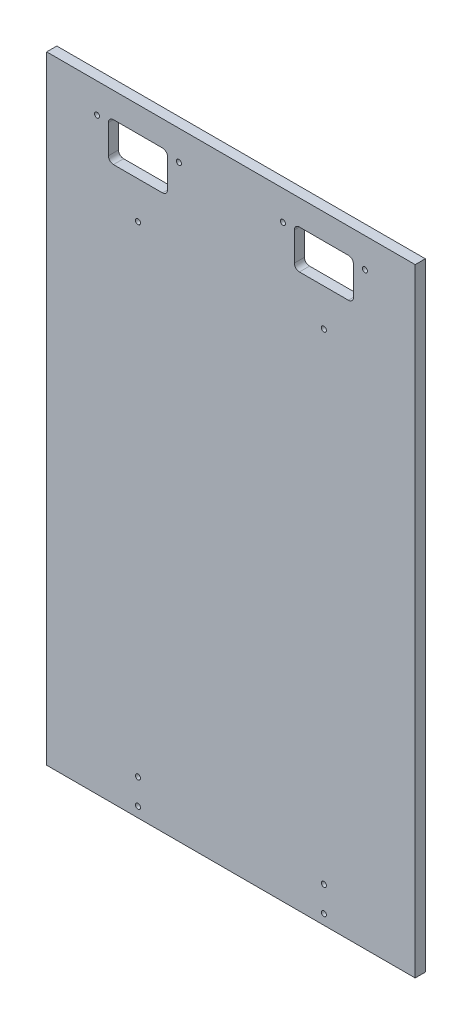
ISO-10303-21;
HEADER;
FILE_DESCRIPTION(('STEP AP214'),'2;1');
FILE_NAME('part.step','',(''),(''),'','','');
FILE_SCHEMA(('AUTOMOTIVE_DESIGN { 1 0 10303 214 1 1 1 1 }'));
ENDSEC;
DATA;
#1=APPLICATION_CONTEXT('core data for automotive mechanical design processes');
#2=APPLICATION_PROTOCOL_DEFINITION('international standard','automotive_design',2000,#1);
#3=PRODUCT_CONTEXT('',#1,'mechanical');
#4=PRODUCT('Part','Part','',(#3));
#5=PRODUCT_RELATED_PRODUCT_CATEGORY('part','',(#4));
#6=PRODUCT_DEFINITION_FORMATION('','',#4);
#7=PRODUCT_DEFINITION_CONTEXT('part definition',#1,'design');
#8=PRODUCT_DEFINITION('design','',#6,#7);
#9=PRODUCT_DEFINITION_SHAPE('','',#8);
#10=(LENGTH_UNIT() NAMED_UNIT(*) SI_UNIT(.MILLI.,.METRE.));
#11=(NAMED_UNIT(*) PLANE_ANGLE_UNIT() SI_UNIT($,.RADIAN.));
#12=(NAMED_UNIT(*) SI_UNIT($,.STERADIAN.) SOLID_ANGLE_UNIT());
#13=UNCERTAINTY_MEASURE_WITH_UNIT(LENGTH_MEASURE(1.E-05),#10,'distance_accuracy_value','');
#14=(GEOMETRIC_REPRESENTATION_CONTEXT(3) GLOBAL_UNCERTAINTY_ASSIGNED_CONTEXT((#13)) GLOBAL_UNIT_ASSIGNED_CONTEXT((#10,
#11,#12)) REPRESENTATION_CONTEXT('',''));
#15=CARTESIAN_POINT('',(0.,0.,0.));
#16=DIRECTION('',(0.,0.,1.));
#17=DIRECTION('',(1.,0.,0.));
#18=AXIS2_PLACEMENT_3D('',#15,#16,#17);
#19=CARTESIAN_POINT('',(0.,0.,6.));
#20=DIRECTION('',(0.,0.,1.));
#21=DIRECTION('',(1.,0.,0.));
#22=AXIS2_PLACEMENT_3D('',#19,#20,#21);
#23=PLANE('',#22);
#24=CARTESIAN_POINT('',(55.,266.,6.));
#25=DIRECTION('',(0.,0.,1.));
#26=DIRECTION('',(-1.,0.,0.));
#27=AXIS2_PLACEMENT_3D('',#24,#25,#26);
#28=CIRCLE('',#27,1.5);
#29=CARTESIAN_POINT('',(53.5,266.,6.));
#30=VERTEX_POINT('',#29);
#31=EDGE_CURVE('E811',#30,#30,#28,.T.);
#32=ORIENTED_EDGE('',*,*,#31,.F.);
#33=EDGE_LOOP('',(#32));
#34=FACE_BOUND('',#33,.T.);
#35=CARTESIAN_POINT('',(-30.75,308.5,6.));
#36=DIRECTION('',(0.,0.,1.));
#37=DIRECTION('',(-1.,0.,0.));
#38=AXIS2_PLACEMENT_3D('',#35,#36,#37);
#39=CIRCLE('',#38,1.5);
#40=CARTESIAN_POINT('',(-32.25,308.5,6.));
#41=VERTEX_POINT('',#40);
#42=EDGE_CURVE('E796',#41,#41,#39,.T.);
#43=ORIENTED_EDGE('',*,*,#42,.F.);
#44=EDGE_LOOP('',(#43));
#45=FACE_BOUND('',#44,.T.);
#46=CARTESIAN_POINT('',(-79.25,308.5,6.));
#47=DIRECTION('',(0.,0.,1.));
#48=DIRECTION('',(1.,0.,0.));
#49=AXIS2_PLACEMENT_3D('',#46,#47,#48);
#50=CIRCLE('',#49,1.5);
#51=CARTESIAN_POINT('',(-77.75,308.5,6.));
#52=VERTEX_POINT('',#51);
#53=EDGE_CURVE('E337',#52,#52,#50,.T.);
#54=ORIENTED_EDGE('',*,*,#53,.F.);
#55=EDGE_LOOP('',(#54));
#56=FACE_BOUND('',#55,.T.);
#57=CARTESIAN_POINT('',(55.,-18.4999999999999,6.));
#58=DIRECTION('',(0.,0.,1.));
#59=DIRECTION('',(-1.,0.,0.));
#60=AXIS2_PLACEMENT_3D('',#57,#58,#59);
#61=CIRCLE('',#60,1.5);
#62=CARTESIAN_POINT('',(53.5,-18.4999999999999,6.));
#63=VERTEX_POINT('',#62);
#64=EDGE_CURVE('E364',#63,#63,#61,.T.);
#65=ORIENTED_EDGE('',*,*,#64,.F.);
#66=EDGE_LOOP('',(#65));
#67=FACE_BOUND('',#66,.T.);
#68=CARTESIAN_POINT('',(-55.,-33.4999999999999,6.));
#69=DIRECTION('',(0.,0.,1.));
#70=DIRECTION('',(1.,0.,0.));
#71=AXIS2_PLACEMENT_3D('',#68,#69,#70);
#72=CIRCLE('',#71,1.5);
#73=CARTESIAN_POINT('',(-53.5,-33.4999999999999,6.));
#74=VERTEX_POINT('',#73);
#75=EDGE_CURVE('E365',#74,#74,#72,.T.);
#76=ORIENTED_EDGE('',*,*,#75,.F.);
#77=EDGE_LOOP('',(#76));
#78=FACE_BOUND('',#77,.T.);
#79=DIRECTION('',(-3.71173897856871E-07,-0.999999999999931,0.));
#80=VECTOR('',#79,1.);
#81=CARTESIAN_POINT('',(-108.999999999998,326.,6.));
#82=LINE('',#81,#80);
#83=CARTESIAN_POINT('',(-108.999999999998,326.,6.));
#84=VERTEX_POINT('',#83);
#85=CARTESIAN_POINT('',(-109.000135664058,-39.4999999999999,6.));
#86=VERTEX_POINT('',#85);
#87=EDGE_CURVE('E193',#84,#86,#82,.T.);
#88=ORIENTED_EDGE('',*,*,#87,.T.);
#89=DIRECTION('',(1.,0.,0.));
#90=VECTOR('',#89,1.);
#91=CARTESIAN_POINT('',(-109.000135664058,-39.4999999999999,6.));
#92=LINE('',#91,#90);
#93=CARTESIAN_POINT('',(109.000000000002,-39.4999999999999,6.));
#94=VERTEX_POINT('',#93);
#95=EDGE_CURVE('E181',#86,#94,#92,.T.);
#96=ORIENTED_EDGE('',*,*,#95,.T.);
#97=DIRECTION('',(0.,1.,0.));
#98=VECTOR('',#97,1.);
#99=CARTESIAN_POINT('',(109.000000000002,-39.4999999999999,6.));
#100=LINE('',#99,#98);
#101=CARTESIAN_POINT('',(109.000000000002,326.,6.));
#102=VERTEX_POINT('',#101);
#103=EDGE_CURVE('E192',#94,#102,#100,.T.);
#104=ORIENTED_EDGE('',*,*,#103,.T.);
#105=DIRECTION('',(-1.,0.,0.));
#106=VECTOR('',#105,1.);
#107=CARTESIAN_POINT('',(-108.999999999998,326.,6.));
#108=LINE('',#107,#106);
#109=EDGE_CURVE('E198',#102,#84,#108,.T.);
#110=ORIENTED_EDGE('',*,*,#109,.T.);
#111=EDGE_LOOP('',(#88,#96,#104,#110));
#112=FACE_BOUND('',#111,.T.);
#113=CARTESIAN_POINT('',(-55.,-18.4999999999999,6.));
#114=DIRECTION('',(0.,0.,1.));
#115=DIRECTION('',(1.,0.,0.));
#116=AXIS2_PLACEMENT_3D('',#113,#114,#115);
#117=CIRCLE('',#116,1.5);
#118=CARTESIAN_POINT('',(-53.5,-18.4999999999999,6.));
#119=VERTEX_POINT('',#118);
#120=EDGE_CURVE('E353',#119,#119,#117,.T.);
#121=ORIENTED_EDGE('',*,*,#120,.F.);
#122=EDGE_LOOP('',(#121));
#123=FACE_BOUND('',#122,.T.);
#124=CARTESIAN_POINT('',(55.,-33.4999999999999,6.));
#125=DIRECTION('',(0.,0.,1.));
#126=DIRECTION('',(-1.,0.,0.));
#127=AXIS2_PLACEMENT_3D('',#124,#125,#126);
#128=CIRCLE('',#127,1.5);
#129=CARTESIAN_POINT('',(53.5,-33.4999999999999,6.));
#130=VERTEX_POINT('',#129);
#131=EDGE_CURVE('E341',#130,#130,#128,.T.);
#132=ORIENTED_EDGE('',*,*,#131,.F.);
#133=EDGE_LOOP('',(#132));
#134=FACE_BOUND('',#133,.T.);
#135=DIRECTION('',(1.,0.,0.));
#136=VECTOR('',#135,1.);
#137=CARTESIAN_POINT('',(-37.4999999999983,288.,6.));
#138=LINE('',#137,#136);
#139=CARTESIAN_POINT('',(-69.4999999999983,288.,6.));
#140=VERTEX_POINT('',#139);
#141=CARTESIAN_POINT('',(-40.4999999999983,288.,6.));
#142=VERTEX_POINT('',#141);
#143=EDGE_CURVE('E306',#140,#142,#138,.T.);
#144=ORIENTED_EDGE('',*,*,#143,.F.);
#145=CARTESIAN_POINT('',(-69.4999999999983,291.,6.));
#146=DIRECTION('',(0.,0.,1.));
#147=DIRECTION('',(1.,0.,0.));
#148=AXIS2_PLACEMENT_3D('',#145,#146,#147);
#149=CIRCLE('',#148,3.);
#150=CARTESIAN_POINT('',(-72.4999999999983,291.,6.));
#151=VERTEX_POINT('',#150);
#152=EDGE_CURVE('E12',#140,#151,#149,.F.);
#153=ORIENTED_EDGE('',*,*,#152,.T.);
#154=DIRECTION('',(0.,-1.,0.));
#155=VECTOR('',#154,1.);
#156=CARTESIAN_POINT('',(-72.4999999999983,288.,6.));
#157=LINE('',#156,#155);
#158=CARTESIAN_POINT('',(-72.4999999999983,308.,6.));
#159=VERTEX_POINT('',#158);
#160=EDGE_CURVE('E304',#159,#151,#157,.T.);
#161=ORIENTED_EDGE('',*,*,#160,.F.);
#162=CARTESIAN_POINT('',(-69.4999999999983,308.,6.));
#163=DIRECTION('',(0.,0.,1.));
#164=DIRECTION('',(1.,0.,0.));
#165=AXIS2_PLACEMENT_3D('',#162,#163,#164);
#166=CIRCLE('',#165,3.);
#167=CARTESIAN_POINT('',(-69.4999999999983,311.,6.));
#168=VERTEX_POINT('',#167);
#169=EDGE_CURVE('E274',#159,#168,#166,.F.);
#170=ORIENTED_EDGE('',*,*,#169,.T.);
#171=DIRECTION('',(-1.,0.,0.));
#172=VECTOR('',#171,1.);
#173=CARTESIAN_POINT('',(-37.4999999999983,311.,6.));
#174=LINE('',#173,#172);
#175=CARTESIAN_POINT('',(-40.4999999999983,311.,6.));
#176=VERTEX_POINT('',#175);
#177=EDGE_CURVE('E330',#176,#168,#174,.T.);
#178=ORIENTED_EDGE('',*,*,#177,.F.);
#179=CARTESIAN_POINT('',(-40.4999999999983,308.,6.));
#180=DIRECTION('',(0.,0.,1.));
#181=DIRECTION('',(1.,0.,0.));
#182=AXIS2_PLACEMENT_3D('',#179,#180,#181);
#183=CIRCLE('',#182,3.);
#184=CARTESIAN_POINT('',(-37.4999999999983,308.,6.));
#185=VERTEX_POINT('',#184);
#186=EDGE_CURVE('E279',#176,#185,#183,.F.);
#187=ORIENTED_EDGE('',*,*,#186,.T.);
#188=DIRECTION('',(0.,1.,0.));
#189=VECTOR('',#188,1.);
#190=CARTESIAN_POINT('',(-37.4999999999983,288.,6.));
#191=LINE('',#190,#189);
#192=CARTESIAN_POINT('',(-37.4999999999983,291.,6.));
#193=VERTEX_POINT('',#192);
#194=EDGE_CURVE('E314',#193,#185,#191,.T.);
#195=ORIENTED_EDGE('',*,*,#194,.F.);
#196=CARTESIAN_POINT('',(-40.4999999999983,291.,6.));
#197=DIRECTION('',(0.,0.,1.));
#198=DIRECTION('',(1.,0.,0.));
#199=AXIS2_PLACEMENT_3D('',#196,#197,#198);
#200=CIRCLE('',#199,3.);
#201=EDGE_CURVE('E58',#193,#142,#200,.F.);
#202=ORIENTED_EDGE('',*,*,#201,.T.);
#203=EDGE_LOOP('',(#144,#153,#161,#170,#178,#187,#195,#202));
#204=FACE_BOUND('',#203,.T.);
#205=CARTESIAN_POINT('',(-55.,266.,6.));
#206=DIRECTION('',(0.,0.,1.));
#207=DIRECTION('',(1.,0.,0.));
#208=AXIS2_PLACEMENT_3D('',#205,#206,#207);
#209=CIRCLE('',#208,1.5);
#210=CARTESIAN_POINT('',(-53.5,266.,6.));
#211=VERTEX_POINT('',#210);
#212=EDGE_CURVE('E571',#211,#211,#209,.T.);
#213=ORIENTED_EDGE('',*,*,#212,.F.);
#214=EDGE_LOOP('',(#213));
#215=FACE_BOUND('',#214,.T.);
#216=CARTESIAN_POINT('',(30.75,308.5,6.));
#217=DIRECTION('',(0.,0.,1.));
#218=DIRECTION('',(1.,0.,0.));
#219=AXIS2_PLACEMENT_3D('',#216,#217,#218);
#220=CIRCLE('',#219,1.5);
#221=CARTESIAN_POINT('',(32.25,308.5,6.));
#222=VERTEX_POINT('',#221);
#223=EDGE_CURVE('E566',#222,#222,#220,.T.);
#224=ORIENTED_EDGE('',*,*,#223,.F.);
#225=EDGE_LOOP('',(#224));
#226=FACE_BOUND('',#225,.T.);
#227=CARTESIAN_POINT('',(79.25,308.5,6.));
#228=DIRECTION('',(0.,0.,1.));
#229=DIRECTION('',(-1.,0.,0.));
#230=AXIS2_PLACEMENT_3D('',#227,#228,#229);
#231=CIRCLE('',#230,1.5);
#232=CARTESIAN_POINT('',(77.75,308.5,6.));
#233=VERTEX_POINT('',#232);
#234=EDGE_CURVE('E527',#233,#233,#231,.T.);
#235=ORIENTED_EDGE('',*,*,#234,.F.);
#236=EDGE_LOOP('',(#235));
#237=FACE_BOUND('',#236,.T.);
#238=DIRECTION('',(0.,1.,0.));
#239=VECTOR('',#238,1.);
#240=CARTESIAN_POINT('',(72.4999999999983,288.,6.));
#241=LINE('',#240,#239);
#242=CARTESIAN_POINT('',(72.4999999999983,291.,6.));
#243=VERTEX_POINT('',#242);
#244=CARTESIAN_POINT('',(72.4999999999983,308.,6.));
#245=VERTEX_POINT('',#244);
#246=EDGE_CURVE('E541',#243,#245,#241,.T.);
#247=ORIENTED_EDGE('',*,*,#246,.F.);
#248=CARTESIAN_POINT('',(69.4999999999983,291.,6.));
#249=DIRECTION('',(0.,0.,1.));
#250=DIRECTION('',(1.,0.,0.));
#251=AXIS2_PLACEMENT_3D('',#248,#249,#250);
#252=CIRCLE('',#251,3.);
#253=CARTESIAN_POINT('',(69.4999999999983,288.,6.));
#254=VERTEX_POINT('',#253);
#255=EDGE_CURVE('E259',#243,#254,#252,.F.);
#256=ORIENTED_EDGE('',*,*,#255,.T.);
#257=DIRECTION('',(1.,0.,0.));
#258=VECTOR('',#257,1.);
#259=CARTESIAN_POINT('',(37.4999999999983,288.,6.));
#260=LINE('',#259,#258);
#261=CARTESIAN_POINT('',(40.4999999999983,288.,6.));
#262=VERTEX_POINT('',#261);
#263=EDGE_CURVE('E526',#262,#254,#260,.T.);
#264=ORIENTED_EDGE('',*,*,#263,.F.);
#265=CARTESIAN_POINT('',(40.4999999999983,291.,6.));
#266=DIRECTION('',(0.,0.,1.));
#267=DIRECTION('',(1.,0.,0.));
#268=AXIS2_PLACEMENT_3D('',#265,#266,#267);
#269=CIRCLE('',#268,3.);
#270=CARTESIAN_POINT('',(37.4999999999983,291.,6.));
#271=VERTEX_POINT('',#270);
#272=EDGE_CURVE('E254',#262,#271,#269,.F.);
#273=ORIENTED_EDGE('',*,*,#272,.T.);
#274=DIRECTION('',(0.,-1.,0.));
#275=VECTOR('',#274,1.);
#276=CARTESIAN_POINT('',(37.4999999999983,288.,6.));
#277=LINE('',#276,#275);
#278=CARTESIAN_POINT('',(37.4999999999983,308.,6.));
#279=VERTEX_POINT('',#278);
#280=EDGE_CURVE('E495',#279,#271,#277,.T.);
#281=ORIENTED_EDGE('',*,*,#280,.F.);
#282=CARTESIAN_POINT('',(40.4999999999983,308.,6.));
#283=DIRECTION('',(0.,0.,1.));
#284=DIRECTION('',(1.,0.,0.));
#285=AXIS2_PLACEMENT_3D('',#282,#283,#284);
#286=CIRCLE('',#285,3.);
#287=CARTESIAN_POINT('',(40.4999999999983,311.,6.));
#288=VERTEX_POINT('',#287);
#289=EDGE_CURVE('E269',#279,#288,#286,.F.);
#290=ORIENTED_EDGE('',*,*,#289,.T.);
#291=DIRECTION('',(-1.,0.,0.));
#292=VECTOR('',#291,1.);
#293=CARTESIAN_POINT('',(37.4999999999983,311.,6.));
#294=LINE('',#293,#292);
#295=CARTESIAN_POINT('',(69.4999999999983,311.,6.));
#296=VERTEX_POINT('',#295);
#297=EDGE_CURVE('E504',#296,#288,#294,.T.);
#298=ORIENTED_EDGE('',*,*,#297,.F.);
#299=CARTESIAN_POINT('',(69.4999999999983,308.,6.));
#300=DIRECTION('',(0.,0.,1.));
#301=DIRECTION('',(1.,0.,0.));
#302=AXIS2_PLACEMENT_3D('',#299,#300,#301);
#303=CIRCLE('',#302,3.);
#304=EDGE_CURVE('E264',#296,#245,#303,.F.);
#305=ORIENTED_EDGE('',*,*,#304,.T.);
#306=EDGE_LOOP('',(#247,#256,#264,#273,#281,#290,#298,#305));
#307=FACE_BOUND('',#306,.T.);
#308=ADVANCED_FACE('F42',(#34,#45,#56,#67,#78,#112,#123,#134,#204,#215,#226,#237,#307),#23,.T.);
#309=CARTESIAN_POINT('',(0.,0.,0.));
#310=DIRECTION('',(0.,0.,1.));
#311=DIRECTION('',(1.,0.,0.));
#312=AXIS2_PLACEMENT_3D('',#309,#310,#311);
#313=PLANE('',#312);
#314=CARTESIAN_POINT('',(79.25,308.5,0.));
#315=DIRECTION('',(0.,0.,1.));
#316=DIRECTION('',(-1.,0.,0.));
#317=AXIS2_PLACEMENT_3D('',#314,#315,#316);
#318=CIRCLE('',#317,1.5);
#319=CARTESIAN_POINT('',(77.75,308.5,0.));
#320=VERTEX_POINT('',#319);
#321=EDGE_CURVE('E503',#320,#320,#318,.T.);
#322=ORIENTED_EDGE('',*,*,#321,.T.);
#323=EDGE_LOOP('',(#322));
#324=FACE_BOUND('',#323,.T.);
#325=CARTESIAN_POINT('',(55.,266.,0.));
#326=DIRECTION('',(0.,0.,1.));
#327=DIRECTION('',(-1.,0.,0.));
#328=AXIS2_PLACEMENT_3D('',#325,#326,#327);
#329=CIRCLE('',#328,1.5);
#330=CARTESIAN_POINT('',(53.5,266.,0.));
#331=VERTEX_POINT('',#330);
#332=EDGE_CURVE('E532',#331,#331,#329,.T.);
#333=ORIENTED_EDGE('',*,*,#332,.T.);
#334=EDGE_LOOP('',(#333));
#335=FACE_BOUND('',#334,.T.);
#336=CARTESIAN_POINT('',(30.75,308.5,0.));
#337=DIRECTION('',(0.,0.,1.));
#338=DIRECTION('',(1.,0.,0.));
#339=AXIS2_PLACEMENT_3D('',#336,#337,#338);
#340=CIRCLE('',#339,1.5);
#341=CARTESIAN_POINT('',(32.25,308.5,0.));
#342=VERTEX_POINT('',#341);
#343=EDGE_CURVE('E570',#342,#342,#340,.T.);
#344=ORIENTED_EDGE('',*,*,#343,.T.);
#345=EDGE_LOOP('',(#344));
#346=FACE_BOUND('',#345,.T.);
#347=CARTESIAN_POINT('',(-30.75,308.5,0.));
#348=DIRECTION('',(0.,0.,1.));
#349=DIRECTION('',(-1.,0.,0.));
#350=AXIS2_PLACEMENT_3D('',#347,#348,#349);
#351=CIRCLE('',#350,1.5);
#352=CARTESIAN_POINT('',(-32.25,308.5,0.));
#353=VERTEX_POINT('',#352);
#354=EDGE_CURVE('E569',#353,#353,#351,.T.);
#355=ORIENTED_EDGE('',*,*,#354,.T.);
#356=EDGE_LOOP('',(#355));
#357=FACE_BOUND('',#356,.T.);
#358=CARTESIAN_POINT('',(-55.,266.,0.));
#359=DIRECTION('',(0.,0.,1.));
#360=DIRECTION('',(1.,0.,0.));
#361=AXIS2_PLACEMENT_3D('',#358,#359,#360);
#362=CIRCLE('',#361,1.5);
#363=CARTESIAN_POINT('',(-53.5,266.,0.));
#364=VERTEX_POINT('',#363);
#365=EDGE_CURVE('E573',#364,#364,#362,.T.);
#366=ORIENTED_EDGE('',*,*,#365,.T.);
#367=EDGE_LOOP('',(#366));
#368=FACE_BOUND('',#367,.T.);
#369=CARTESIAN_POINT('',(-79.25,308.5,0.));
#370=DIRECTION('',(0.,0.,1.));
#371=DIRECTION('',(1.,0.,0.));
#372=AXIS2_PLACEMENT_3D('',#369,#370,#371);
#373=CIRCLE('',#372,1.5);
#374=CARTESIAN_POINT('',(-77.75,308.5,0.));
#375=VERTEX_POINT('',#374);
#376=EDGE_CURVE('E319',#375,#375,#373,.T.);
#377=ORIENTED_EDGE('',*,*,#376,.T.);
#378=EDGE_LOOP('',(#377));
#379=FACE_BOUND('',#378,.T.);
#380=DIRECTION('',(-1.,0.,0.));
#381=VECTOR('',#380,1.);
#382=CARTESIAN_POINT('',(-37.4999999999983,311.,0.));
#383=LINE('',#382,#381);
#384=CARTESIAN_POINT('',(-40.4999999999983,311.,0.));
#385=VERTEX_POINT('',#384);
#386=CARTESIAN_POINT('',(-69.4999999999983,311.,0.));
#387=VERTEX_POINT('',#386);
#388=EDGE_CURVE('E311',#385,#387,#383,.T.);
#389=ORIENTED_EDGE('',*,*,#388,.T.);
#390=CARTESIAN_POINT('',(-69.4999999999983,308.,0.));
#391=DIRECTION('',(0.,0.,1.));
#392=DIRECTION('',(1.,0.,0.));
#393=AXIS2_PLACEMENT_3D('',#390,#391,#392);
#394=CIRCLE('',#393,3.);
#395=CARTESIAN_POINT('',(-72.4999999999983,308.,0.));
#396=VERTEX_POINT('',#395);
#397=EDGE_CURVE('E272',#387,#396,#394,.T.);
#398=ORIENTED_EDGE('',*,*,#397,.T.);
#399=DIRECTION('',(0.,-1.,0.));
#400=VECTOR('',#399,1.);
#401=CARTESIAN_POINT('',(-72.4999999999983,288.,0.));
#402=LINE('',#401,#400);
#403=CARTESIAN_POINT('',(-72.4999999999983,291.,0.));
#404=VERTEX_POINT('',#403);
#405=EDGE_CURVE('E293',#396,#404,#402,.T.);
#406=ORIENTED_EDGE('',*,*,#405,.T.);
#407=CARTESIAN_POINT('',(-69.4999999999983,291.,0.));
#408=DIRECTION('',(0.,0.,1.));
#409=DIRECTION('',(1.,0.,0.));
#410=AXIS2_PLACEMENT_3D('',#407,#408,#409);
#411=CIRCLE('',#410,3.);
#412=CARTESIAN_POINT('',(-69.4999999999983,288.,0.));
#413=VERTEX_POINT('',#412);
#414=EDGE_CURVE('E51',#404,#413,#411,.T.);
#415=ORIENTED_EDGE('',*,*,#414,.T.);
#416=DIRECTION('',(1.,0.,0.));
#417=VECTOR('',#416,1.);
#418=CARTESIAN_POINT('',(-37.4999999999983,288.,0.));
#419=LINE('',#418,#417);
#420=CARTESIAN_POINT('',(-40.4999999999983,288.,0.));
#421=VERTEX_POINT('',#420);
#422=EDGE_CURVE('E291',#413,#421,#419,.T.);
#423=ORIENTED_EDGE('',*,*,#422,.T.);
#424=CARTESIAN_POINT('',(-40.4999999999983,291.,0.));
#425=DIRECTION('',(0.,0.,1.));
#426=DIRECTION('',(1.,0.,0.));
#427=AXIS2_PLACEMENT_3D('',#424,#425,#426);
#428=CIRCLE('',#427,3.);
#429=CARTESIAN_POINT('',(-37.4999999999983,291.,0.));
#430=VERTEX_POINT('',#429);
#431=EDGE_CURVE('E282',#421,#430,#428,.T.);
#432=ORIENTED_EDGE('',*,*,#431,.T.);
#433=DIRECTION('',(0.,1.,0.));
#434=VECTOR('',#433,1.);
#435=CARTESIAN_POINT('',(-37.4999999999983,288.,0.));
#436=LINE('',#435,#434);
#437=CARTESIAN_POINT('',(-37.4999999999983,308.,0.));
#438=VERTEX_POINT('',#437);
#439=EDGE_CURVE('E298',#430,#438,#436,.T.);
#440=ORIENTED_EDGE('',*,*,#439,.T.);
#441=CARTESIAN_POINT('',(-40.4999999999983,308.,0.));
#442=DIRECTION('',(0.,0.,1.));
#443=DIRECTION('',(1.,0.,0.));
#444=AXIS2_PLACEMENT_3D('',#441,#442,#443);
#445=CIRCLE('',#444,3.);
#446=EDGE_CURVE('E277',#438,#385,#445,.T.);
#447=ORIENTED_EDGE('',*,*,#446,.T.);
#448=EDGE_LOOP('',(#389,#398,#406,#415,#423,#432,#440,#447));
#449=FACE_BOUND('',#448,.T.);
#450=DIRECTION('',(-3.71173897856871E-07,-0.999999999999931,0.));
#451=VECTOR('',#450,1.);
#452=CARTESIAN_POINT('',(-108.999999999998,326.,0.));
#453=LINE('',#452,#451);
#454=CARTESIAN_POINT('',(-108.999999999998,326.,0.));
#455=VERTEX_POINT('',#454);
#456=CARTESIAN_POINT('',(-109.000135664058,-39.4999999999999,0.));
#457=VERTEX_POINT('',#456);
#458=EDGE_CURVE('E207',#455,#457,#453,.T.);
#459=ORIENTED_EDGE('',*,*,#458,.F.);
#460=DIRECTION('',(-1.,0.,0.));
#461=VECTOR('',#460,1.);
#462=CARTESIAN_POINT('',(-108.999999999998,326.,0.));
#463=LINE('',#462,#461);
#464=CARTESIAN_POINT('',(109.000000000002,326.,0.));
#465=VERTEX_POINT('',#464);
#466=EDGE_CURVE('E203',#465,#455,#463,.T.);
#467=ORIENTED_EDGE('',*,*,#466,.F.);
#468=DIRECTION('',(0.,1.,0.));
#469=VECTOR('',#468,1.);
#470=CARTESIAN_POINT('',(109.000000000002,-39.4999999999999,0.));
#471=LINE('',#470,#469);
#472=CARTESIAN_POINT('',(109.000000000002,-39.4999999999999,0.));
#473=VERTEX_POINT('',#472);
#474=EDGE_CURVE('E388',#473,#465,#471,.T.);
#475=ORIENTED_EDGE('',*,*,#474,.F.);
#476=DIRECTION('',(1.,0.,0.));
#477=VECTOR('',#476,1.);
#478=CARTESIAN_POINT('',(-109.000135664058,-39.4999999999999,0.));
#479=LINE('',#478,#477);
#480=EDGE_CURVE('E385',#457,#473,#479,.T.);
#481=ORIENTED_EDGE('',*,*,#480,.F.);
#482=EDGE_LOOP('',(#459,#467,#475,#481));
#483=FACE_BOUND('',#482,.T.);
#484=CARTESIAN_POINT('',(-55.,-33.4999999999999,0.));
#485=DIRECTION('',(0.,0.,1.));
#486=DIRECTION('',(1.,0.,0.));
#487=AXIS2_PLACEMENT_3D('',#484,#485,#486);
#488=CIRCLE('',#487,1.5);
#489=CARTESIAN_POINT('',(-53.5,-33.4999999999999,0.));
#490=VERTEX_POINT('',#489);
#491=EDGE_CURVE('E359',#490,#490,#488,.T.);
#492=ORIENTED_EDGE('',*,*,#491,.T.);
#493=EDGE_LOOP('',(#492));
#494=FACE_BOUND('',#493,.T.);
#495=CARTESIAN_POINT('',(-55.,-18.4999999999999,0.));
#496=DIRECTION('',(0.,0.,1.));
#497=DIRECTION('',(1.,0.,0.));
#498=AXIS2_PLACEMENT_3D('',#495,#496,#497);
#499=CIRCLE('',#498,1.5);
#500=CARTESIAN_POINT('',(-53.5,-18.4999999999999,0.));
#501=VERTEX_POINT('',#500);
#502=EDGE_CURVE('E360',#501,#501,#499,.T.);
#503=ORIENTED_EDGE('',*,*,#502,.T.);
#504=EDGE_LOOP('',(#503));
#505=FACE_BOUND('',#504,.T.);
#506=CARTESIAN_POINT('',(55.,-18.4999999999999,0.));
#507=DIRECTION('',(0.,0.,1.));
#508=DIRECTION('',(-1.,0.,0.));
#509=AXIS2_PLACEMENT_3D('',#506,#507,#508);
#510=CIRCLE('',#509,1.5);
#511=CARTESIAN_POINT('',(53.5,-18.4999999999999,0.));
#512=VERTEX_POINT('',#511);
#513=EDGE_CURVE('E346',#512,#512,#510,.T.);
#514=ORIENTED_EDGE('',*,*,#513,.T.);
#515=EDGE_LOOP('',(#514));
#516=FACE_BOUND('',#515,.T.);
#517=CARTESIAN_POINT('',(55.,-33.4999999999999,0.));
#518=DIRECTION('',(0.,0.,1.));
#519=DIRECTION('',(-1.,0.,0.));
#520=AXIS2_PLACEMENT_3D('',#517,#518,#519);
#521=CIRCLE('',#520,1.5);
#522=CARTESIAN_POINT('',(53.5,-33.4999999999999,0.));
#523=VERTEX_POINT('',#522);
#524=EDGE_CURVE('E335',#523,#523,#521,.T.);
#525=ORIENTED_EDGE('',*,*,#524,.T.);
#526=EDGE_LOOP('',(#525));
#527=FACE_BOUND('',#526,.T.);
#528=DIRECTION('',(0.,-1.,0.));
#529=VECTOR('',#528,1.);
#530=CARTESIAN_POINT('',(37.4999999999983,288.,0.));
#531=LINE('',#530,#529);
#532=CARTESIAN_POINT('',(37.4999999999983,308.,0.));
#533=VERTEX_POINT('',#532);
#534=CARTESIAN_POINT('',(37.4999999999983,291.,0.));
#535=VERTEX_POINT('',#534);
#536=EDGE_CURVE('E512',#533,#535,#531,.T.);
#537=ORIENTED_EDGE('',*,*,#536,.T.);
#538=CARTESIAN_POINT('',(40.4999999999983,291.,0.));
#539=DIRECTION('',(0.,0.,1.));
#540=DIRECTION('',(1.,0.,0.));
#541=AXIS2_PLACEMENT_3D('',#538,#539,#540);
#542=CIRCLE('',#541,3.);
#543=CARTESIAN_POINT('',(40.4999999999983,288.,0.));
#544=VERTEX_POINT('',#543);
#545=EDGE_CURVE('E252',#535,#544,#542,.T.);
#546=ORIENTED_EDGE('',*,*,#545,.T.);
#547=DIRECTION('',(1.,0.,0.));
#548=VECTOR('',#547,1.);
#549=CARTESIAN_POINT('',(37.4999999999983,288.,0.));
#550=LINE('',#549,#548);
#551=CARTESIAN_POINT('',(69.4999999999983,288.,0.));
#552=VERTEX_POINT('',#551);
#553=EDGE_CURVE('E511',#544,#552,#550,.T.);
#554=ORIENTED_EDGE('',*,*,#553,.T.);
#555=CARTESIAN_POINT('',(69.4999999999983,291.,0.));
#556=DIRECTION('',(0.,0.,1.));
#557=DIRECTION('',(1.,0.,0.));
#558=AXIS2_PLACEMENT_3D('',#555,#556,#557);
#559=CIRCLE('',#558,3.);
#560=CARTESIAN_POINT('',(72.4999999999983,291.,0.));
#561=VERTEX_POINT('',#560);
#562=EDGE_CURVE('E257',#552,#561,#559,.T.);
#563=ORIENTED_EDGE('',*,*,#562,.T.);
#564=DIRECTION('',(0.,1.,0.));
#565=VECTOR('',#564,1.);
#566=CARTESIAN_POINT('',(72.4999999999983,288.,0.));
#567=LINE('',#566,#565);
#568=CARTESIAN_POINT('',(72.4999999999983,308.,0.));
#569=VERTEX_POINT('',#568);
#570=EDGE_CURVE('E516',#561,#569,#567,.T.);
#571=ORIENTED_EDGE('',*,*,#570,.T.);
#572=CARTESIAN_POINT('',(69.4999999999983,308.,0.));
#573=DIRECTION('',(0.,0.,1.));
#574=DIRECTION('',(1.,0.,0.));
#575=AXIS2_PLACEMENT_3D('',#572,#573,#574);
#576=CIRCLE('',#575,3.);
#577=CARTESIAN_POINT('',(69.4999999999983,311.,0.));
#578=VERTEX_POINT('',#577);
#579=EDGE_CURVE('E262',#569,#578,#576,.T.);
#580=ORIENTED_EDGE('',*,*,#579,.T.);
#581=DIRECTION('',(-1.,0.,0.));
#582=VECTOR('',#581,1.);
#583=CARTESIAN_POINT('',(37.4999999999983,311.,0.));
#584=LINE('',#583,#582);
#585=CARTESIAN_POINT('',(40.4999999999983,311.,0.));
#586=VERTEX_POINT('',#585);
#587=EDGE_CURVE('E519',#578,#586,#584,.T.);
#588=ORIENTED_EDGE('',*,*,#587,.T.);
#589=CARTESIAN_POINT('',(40.4999999999983,308.,0.));
#590=DIRECTION('',(0.,0.,1.));
#591=DIRECTION('',(1.,0.,0.));
#592=AXIS2_PLACEMENT_3D('',#589,#590,#591);
#593=CIRCLE('',#592,3.);
#594=EDGE_CURVE('E267',#586,#533,#593,.T.);
#595=ORIENTED_EDGE('',*,*,#594,.T.);
#596=EDGE_LOOP('',(#537,#546,#554,#563,#571,#580,#588,#595));
#597=FACE_BOUND('',#596,.T.);
#598=ADVANCED_FACE('F289',(#324,#335,#346,#357,#368,#379,#449,#483,#494,#505,#516,#527,#597),
#313,.F.);
#599=CARTESIAN_POINT('',(-108.999999999998,326.,6.));
#600=DIRECTION('',(0.999999999999931,-3.71173897856871E-07,0.));
#601=DIRECTION('',(3.71173897856871E-07,0.999999999999931,0.));
#602=AXIS2_PLACEMENT_3D('',#599,#600,#601);
#603=PLANE('',#602);
#604=ORIENTED_EDGE('',*,*,#458,.T.);
#605=DIRECTION('',(0.,0.,-1.));
#606=VECTOR('',#605,1.);
#607=CARTESIAN_POINT('',(-109.000135664058,-39.4999999999999,6.));
#608=LINE('',#607,#606);
#609=EDGE_CURVE('E185',#86,#457,#608,.T.);
#610=ORIENTED_EDGE('',*,*,#609,.F.);
#611=ORIENTED_EDGE('',*,*,#87,.F.);
#612=DIRECTION('',(0.,0.,-1.));
#613=VECTOR('',#612,1.);
#614=CARTESIAN_POINT('',(-108.999999999998,326.,6.));
#615=LINE('',#614,#613);
#616=EDGE_CURVE('E383',#84,#455,#615,.T.);
#617=ORIENTED_EDGE('',*,*,#616,.T.);
#618=EDGE_LOOP('',(#604,#610,#611,#617));
#619=FACE_BOUND('',#618,.T.);
#620=ADVANCED_FACE('F205',(#619),#603,.F.);
#621=CARTESIAN_POINT('',(-109.000135664058,-39.4999999999999,6.));
#622=DIRECTION('',(0.,1.,0.));
#623=DIRECTION('',(0.,0.,1.));
#624=AXIS2_PLACEMENT_3D('',#621,#622,#623);
#625=PLANE('',#624);
#626=ORIENTED_EDGE('',*,*,#480,.T.);
#627=DIRECTION('',(0.,0.,-1.));
#628=VECTOR('',#627,1.);
#629=CARTESIAN_POINT('',(109.000000000002,-39.4999999999999,6.));
#630=LINE('',#629,#628);
#631=EDGE_CURVE('E188',#94,#473,#630,.T.);
#632=ORIENTED_EDGE('',*,*,#631,.F.);
#633=ORIENTED_EDGE('',*,*,#95,.F.);
#634=ORIENTED_EDGE('',*,*,#609,.T.);
#635=EDGE_LOOP('',(#626,#632,#633,#634));
#636=FACE_BOUND('',#635,.T.);
#637=ADVANCED_FACE('F183',(#636),#625,.F.);
#638=CARTESIAN_POINT('',(109.000000000002,-39.4999999999999,6.));
#639=DIRECTION('',(-1.,0.,0.));
#640=DIRECTION('',(0.,0.,1.));
#641=AXIS2_PLACEMENT_3D('',#638,#639,#640);
#642=PLANE('',#641);
#643=ORIENTED_EDGE('',*,*,#474,.T.);
#644=DIRECTION('',(0.,0.,-1.));
#645=VECTOR('',#644,1.);
#646=CARTESIAN_POINT('',(109.000000000002,326.,6.));
#647=LINE('',#646,#645);
#648=EDGE_CURVE('E212',#102,#465,#647,.T.);
#649=ORIENTED_EDGE('',*,*,#648,.F.);
#650=ORIENTED_EDGE('',*,*,#103,.F.);
#651=ORIENTED_EDGE('',*,*,#631,.T.);
#652=EDGE_LOOP('',(#643,#649,#650,#651));
#653=FACE_BOUND('',#652,.T.);
#654=ADVANCED_FACE('F399',(#653),#642,.F.);
#655=CARTESIAN_POINT('',(-108.999999999998,326.,6.));
#656=DIRECTION('',(0.,-1.,0.));
#657=DIRECTION('',(0.,0.,-1.));
#658=AXIS2_PLACEMENT_3D('',#655,#656,#657);
#659=PLANE('',#658);
#660=ORIENTED_EDGE('',*,*,#466,.T.);
#661=ORIENTED_EDGE('',*,*,#616,.F.);
#662=ORIENTED_EDGE('',*,*,#109,.F.);
#663=ORIENTED_EDGE('',*,*,#648,.T.);
#664=EDGE_LOOP('',(#660,#661,#662,#663));
#665=FACE_BOUND('',#664,.T.);
#666=ADVANCED_FACE('F395',(#665),#659,.F.);
#667=CARTESIAN_POINT('',(-55.,-33.4999999999999,6.));
#668=DIRECTION('',(0.,0.,-1.));
#669=DIRECTION('',(-1.,0.,0.));
#670=AXIS2_PLACEMENT_3D('',#667,#668,#669);
#671=CYLINDRICAL_SURFACE('',#670,1.5);
#672=ORIENTED_EDGE('',*,*,#75,.T.);
#673=EDGE_LOOP('',(#672));
#674=FACE_BOUND('',#673,.T.);
#675=ORIENTED_EDGE('',*,*,#491,.F.);
#676=EDGE_LOOP('',(#675));
#677=FACE_BOUND('',#676,.T.);
#678=ADVANCED_FACE('F406',(#674,#677),#671,.F.);
#679=CARTESIAN_POINT('',(-55.,-18.4999999999999,6.));
#680=DIRECTION('',(0.,0.,-1.));
#681=DIRECTION('',(-1.,0.,0.));
#682=AXIS2_PLACEMENT_3D('',#679,#680,#681);
#683=CYLINDRICAL_SURFACE('',#682,1.5);
#684=ORIENTED_EDGE('',*,*,#120,.T.);
#685=EDGE_LOOP('',(#684));
#686=FACE_BOUND('',#685,.T.);
#687=ORIENTED_EDGE('',*,*,#502,.F.);
#688=EDGE_LOOP('',(#687));
#689=FACE_BOUND('',#688,.T.);
#690=ADVANCED_FACE('F422',(#686,#689),#683,.F.);
#691=CARTESIAN_POINT('',(55.,-18.4999999999999,6.));
#692=DIRECTION('',(0.,0.,-1.));
#693=DIRECTION('',(-1.,0.,0.));
#694=AXIS2_PLACEMENT_3D('',#691,#692,#693);
#695=CYLINDRICAL_SURFACE('',#694,1.5);
#696=ORIENTED_EDGE('',*,*,#64,.T.);
#697=EDGE_LOOP('',(#696));
#698=FACE_BOUND('',#697,.T.);
#699=ORIENTED_EDGE('',*,*,#513,.F.);
#700=EDGE_LOOP('',(#699));
#701=FACE_BOUND('',#700,.T.);
#702=ADVANCED_FACE('F426',(#698,#701),#695,.F.);
#703=CARTESIAN_POINT('',(55.,-33.4999999999999,6.));
#704=DIRECTION('',(0.,0.,-1.));
#705=DIRECTION('',(-1.,0.,0.));
#706=AXIS2_PLACEMENT_3D('',#703,#704,#705);
#707=CYLINDRICAL_SURFACE('',#706,1.5);
#708=ORIENTED_EDGE('',*,*,#131,.T.);
#709=EDGE_LOOP('',(#708));
#710=FACE_BOUND('',#709,.T.);
#711=ORIENTED_EDGE('',*,*,#524,.F.);
#712=EDGE_LOOP('',(#711));
#713=FACE_BOUND('',#712,.T.);
#714=ADVANCED_FACE('F430',(#710,#713),#707,.F.);
#715=CARTESIAN_POINT('',(-72.4999999999983,288.,6.));
#716=DIRECTION('',(1.,0.,0.));
#717=DIRECTION('',(0.,0.,-1.));
#718=AXIS2_PLACEMENT_3D('',#715,#716,#717);
#719=PLANE('',#718);
#720=ORIENTED_EDGE('',*,*,#405,.F.);
#721=DIRECTION('',(0.,0.,-1.));
#722=VECTOR('',#721,1.);
#723=CARTESIAN_POINT('',(-72.4999999999983,308.,6.));
#724=LINE('',#723,#722);
#725=EDGE_CURVE('E241',#396,#159,#724,.F.);
#726=ORIENTED_EDGE('',*,*,#725,.T.);
#727=ORIENTED_EDGE('',*,*,#160,.T.);
#728=DIRECTION('',(0.,0.,-1.));
#729=VECTOR('',#728,1.);
#730=CARTESIAN_POINT('',(-72.4999999999983,291.,0.));
#731=LINE('',#730,#729);
#732=EDGE_CURVE('E238',#151,#404,#731,.T.);
#733=ORIENTED_EDGE('',*,*,#732,.T.);
#734=EDGE_LOOP('',(#720,#726,#727,#733));
#735=FACE_BOUND('',#734,.T.);
#736=ADVANCED_FACE('F308',(#735),#719,.T.);
#737=CARTESIAN_POINT('',(-37.4999999999983,288.,6.));
#738=DIRECTION('',(0.,1.,0.));
#739=DIRECTION('',(0.,0.,1.));
#740=AXIS2_PLACEMENT_3D('',#737,#738,#739);
#741=PLANE('',#740);
#742=ORIENTED_EDGE('',*,*,#143,.T.);
#743=DIRECTION('',(0.,0.,-1.));
#744=VECTOR('',#743,1.);
#745=CARTESIAN_POINT('',(-40.4999999999983,288.,0.));
#746=LINE('',#745,#744);
#747=EDGE_CURVE('E249',#142,#421,#746,.T.);
#748=ORIENTED_EDGE('',*,*,#747,.T.);
#749=ORIENTED_EDGE('',*,*,#422,.F.);
#750=DIRECTION('',(0.,0.,-1.));
#751=VECTOR('',#750,1.);
#752=CARTESIAN_POINT('',(-69.4999999999983,288.,6.));
#753=LINE('',#752,#751);
#754=EDGE_CURVE('E65',#413,#140,#753,.F.);
#755=ORIENTED_EDGE('',*,*,#754,.T.);
#756=EDGE_LOOP('',(#742,#748,#749,#755));
#757=FACE_BOUND('',#756,.T.);
#758=ADVANCED_FACE('F296',(#757),#741,.T.);
#759=CARTESIAN_POINT('',(-37.4999999999983,288.,6.));
#760=DIRECTION('',(-1.,0.,0.));
#761=DIRECTION('',(0.,0.,1.));
#762=AXIS2_PLACEMENT_3D('',#759,#760,#761);
#763=PLANE('',#762);
#764=ORIENTED_EDGE('',*,*,#194,.T.);
#765=DIRECTION('',(0.,0.,-1.));
#766=VECTOR('',#765,1.);
#767=CARTESIAN_POINT('',(-37.4999999999983,308.,0.));
#768=LINE('',#767,#766);
#769=EDGE_CURVE('E245',#185,#438,#768,.T.);
#770=ORIENTED_EDGE('',*,*,#769,.T.);
#771=ORIENTED_EDGE('',*,*,#439,.F.);
#772=DIRECTION('',(0.,0.,-1.));
#773=VECTOR('',#772,1.);
#774=CARTESIAN_POINT('',(-37.4999999999983,291.,6.));
#775=LINE('',#774,#773);
#776=EDGE_CURVE('E243',#430,#193,#775,.F.);
#777=ORIENTED_EDGE('',*,*,#776,.T.);
#778=EDGE_LOOP('',(#764,#770,#771,#777));
#779=FACE_BOUND('',#778,.T.);
#780=ADVANCED_FACE('F439',(#779),#763,.T.);
#781=CARTESIAN_POINT('',(-37.4999999999983,311.,6.));
#782=DIRECTION('',(0.,-1.,0.));
#783=DIRECTION('',(0.,0.,-1.));
#784=AXIS2_PLACEMENT_3D('',#781,#782,#783);
#785=PLANE('',#784);
#786=ORIENTED_EDGE('',*,*,#177,.T.);
#787=DIRECTION('',(0.,0.,-1.));
#788=VECTOR('',#787,1.);
#789=CARTESIAN_POINT('',(-69.4999999999983,311.,0.));
#790=LINE('',#789,#788);
#791=EDGE_CURVE('E235',#168,#387,#790,.T.);
#792=ORIENTED_EDGE('',*,*,#791,.T.);
#793=ORIENTED_EDGE('',*,*,#388,.F.);
#794=DIRECTION('',(0.,0.,-1.));
#795=VECTOR('',#794,1.);
#796=CARTESIAN_POINT('',(-40.4999999999983,311.,6.));
#797=LINE('',#796,#795);
#798=EDGE_CURVE('E233',#385,#176,#797,.F.);
#799=ORIENTED_EDGE('',*,*,#798,.T.);
#800=EDGE_LOOP('',(#786,#792,#793,#799));
#801=FACE_BOUND('',#800,.T.);
#802=ADVANCED_FACE('F442',(#801),#785,.T.);
#803=CARTESIAN_POINT('',(-79.25,308.5,6.));
#804=DIRECTION('',(0.,0.,-1.));
#805=DIRECTION('',(-1.,0.,0.));
#806=AXIS2_PLACEMENT_3D('',#803,#804,#805);
#807=CYLINDRICAL_SURFACE('',#806,1.5);
#808=ORIENTED_EDGE('',*,*,#53,.T.);
#809=EDGE_LOOP('',(#808));
#810=FACE_BOUND('',#809,.T.);
#811=ORIENTED_EDGE('',*,*,#376,.F.);
#812=EDGE_LOOP('',(#811));
#813=FACE_BOUND('',#812,.T.);
#814=ADVANCED_FACE('F446',(#810,#813),#807,.F.);
#815=CARTESIAN_POINT('',(-55.,266.,6.));
#816=DIRECTION('',(0.,0.,-1.));
#817=DIRECTION('',(-1.,0.,0.));
#818=AXIS2_PLACEMENT_3D('',#815,#816,#817);
#819=CYLINDRICAL_SURFACE('',#818,1.5);
#820=ORIENTED_EDGE('',*,*,#212,.T.);
#821=EDGE_LOOP('',(#820));
#822=FACE_BOUND('',#821,.T.);
#823=ORIENTED_EDGE('',*,*,#365,.F.);
#824=EDGE_LOOP('',(#823));
#825=FACE_BOUND('',#824,.T.);
#826=ADVANCED_FACE('F450',(#822,#825),#819,.F.);
#827=CARTESIAN_POINT('',(-30.75,308.5,6.));
#828=DIRECTION('',(0.,0.,-1.));
#829=DIRECTION('',(-1.,0.,0.));
#830=AXIS2_PLACEMENT_3D('',#827,#828,#829);
#831=CYLINDRICAL_SURFACE('',#830,1.5);
#832=ORIENTED_EDGE('',*,*,#42,.T.);
#833=EDGE_LOOP('',(#832));
#834=FACE_BOUND('',#833,.T.);
#835=ORIENTED_EDGE('',*,*,#354,.F.);
#836=EDGE_LOOP('',(#835));
#837=FACE_BOUND('',#836,.T.);
#838=ADVANCED_FACE('F454',(#834,#837),#831,.F.);
#839=CARTESIAN_POINT('',(30.75,308.5,6.));
#840=DIRECTION('',(0.,0.,-1.));
#841=DIRECTION('',(-1.,0.,0.));
#842=AXIS2_PLACEMENT_3D('',#839,#840,#841);
#843=CYLINDRICAL_SURFACE('',#842,1.5);
#844=ORIENTED_EDGE('',*,*,#223,.T.);
#845=EDGE_LOOP('',(#844));
#846=FACE_BOUND('',#845,.T.);
#847=ORIENTED_EDGE('',*,*,#343,.F.);
#848=EDGE_LOOP('',(#847));
#849=FACE_BOUND('',#848,.T.);
#850=ADVANCED_FACE('F458',(#846,#849),#843,.F.);
#851=CARTESIAN_POINT('',(55.,266.,6.));
#852=DIRECTION('',(0.,0.,-1.));
#853=DIRECTION('',(-1.,0.,0.));
#854=AXIS2_PLACEMENT_3D('',#851,#852,#853);
#855=CYLINDRICAL_SURFACE('',#854,1.5);
#856=ORIENTED_EDGE('',*,*,#31,.T.);
#857=EDGE_LOOP('',(#856));
#858=FACE_BOUND('',#857,.T.);
#859=ORIENTED_EDGE('',*,*,#332,.F.);
#860=EDGE_LOOP('',(#859));
#861=FACE_BOUND('',#860,.T.);
#862=ADVANCED_FACE('F462',(#858,#861),#855,.F.);
#863=CARTESIAN_POINT('',(79.25,308.5,6.));
#864=DIRECTION('',(0.,0.,-1.));
#865=DIRECTION('',(-1.,0.,0.));
#866=AXIS2_PLACEMENT_3D('',#863,#864,#865);
#867=CYLINDRICAL_SURFACE('',#866,1.5);
#868=ORIENTED_EDGE('',*,*,#234,.T.);
#869=EDGE_LOOP('',(#868));
#870=FACE_BOUND('',#869,.T.);
#871=ORIENTED_EDGE('',*,*,#321,.F.);
#872=EDGE_LOOP('',(#871));
#873=FACE_BOUND('',#872,.T.);
#874=ADVANCED_FACE('F466',(#870,#873),#867,.F.);
#875=CARTESIAN_POINT('',(37.4999999999983,288.,6.));
#876=DIRECTION('',(0.,1.,0.));
#877=DIRECTION('',(0.,0.,1.));
#878=AXIS2_PLACEMENT_3D('',#875,#876,#877);
#879=PLANE('',#878);
#880=ORIENTED_EDGE('',*,*,#553,.F.);
#881=DIRECTION('',(0.,0.,-1.));
#882=VECTOR('',#881,1.);
#883=CARTESIAN_POINT('',(40.4999999999983,288.,6.));
#884=LINE('',#883,#882);
#885=EDGE_CURVE('E221',#544,#262,#884,.F.);
#886=ORIENTED_EDGE('',*,*,#885,.T.);
#887=ORIENTED_EDGE('',*,*,#263,.T.);
#888=DIRECTION('',(0.,0.,-1.));
#889=VECTOR('',#888,1.);
#890=CARTESIAN_POINT('',(69.4999999999983,288.,0.));
#891=LINE('',#890,#889);
#892=EDGE_CURVE('E218',#254,#552,#891,.T.);
#893=ORIENTED_EDGE('',*,*,#892,.T.);
#894=EDGE_LOOP('',(#880,#886,#887,#893));
#895=FACE_BOUND('',#894,.T.);
#896=ADVANCED_FACE('F470',(#895),#879,.T.);
#897=CARTESIAN_POINT('',(72.4999999999983,288.,6.));
#898=DIRECTION('',(-1.,0.,0.));
#899=DIRECTION('',(0.,0.,1.));
#900=AXIS2_PLACEMENT_3D('',#897,#898,#899);
#901=PLANE('',#900);
#902=ORIENTED_EDGE('',*,*,#570,.F.);
#903=DIRECTION('',(0.,0.,-1.));
#904=VECTOR('',#903,1.);
#905=CARTESIAN_POINT('',(72.4999999999983,291.,6.));
#906=LINE('',#905,#904);
#907=EDGE_CURVE('E226',#561,#243,#906,.F.);
#908=ORIENTED_EDGE('',*,*,#907,.T.);
#909=ORIENTED_EDGE('',*,*,#246,.T.);
#910=DIRECTION('',(0.,0.,-1.));
#911=VECTOR('',#910,1.);
#912=CARTESIAN_POINT('',(72.4999999999983,308.,0.));
#913=LINE('',#912,#911);
#914=EDGE_CURVE('E223',#245,#569,#913,.T.);
#915=ORIENTED_EDGE('',*,*,#914,.T.);
#916=EDGE_LOOP('',(#902,#908,#909,#915));
#917=FACE_BOUND('',#916,.T.);
#918=ADVANCED_FACE('F474',(#917),#901,.T.);
#919=CARTESIAN_POINT('',(37.4999999999983,311.,6.));
#920=DIRECTION('',(0.,-1.,0.));
#921=DIRECTION('',(0.,0.,-1.));
#922=AXIS2_PLACEMENT_3D('',#919,#920,#921);
#923=PLANE('',#922);
#924=ORIENTED_EDGE('',*,*,#587,.F.);
#925=DIRECTION('',(0.,0.,-1.));
#926=VECTOR('',#925,1.);
#927=CARTESIAN_POINT('',(69.4999999999983,311.,6.));
#928=LINE('',#927,#926);
#929=EDGE_CURVE('E231',#578,#296,#928,.F.);
#930=ORIENTED_EDGE('',*,*,#929,.T.);
#931=ORIENTED_EDGE('',*,*,#297,.T.);
#932=DIRECTION('',(0.,0.,-1.));
#933=VECTOR('',#932,1.);
#934=CARTESIAN_POINT('',(40.4999999999983,311.,0.));
#935=LINE('',#934,#933);
#936=EDGE_CURVE('E228',#288,#586,#935,.T.);
#937=ORIENTED_EDGE('',*,*,#936,.T.);
#938=EDGE_LOOP('',(#924,#930,#931,#937));
#939=FACE_BOUND('',#938,.T.);
#940=ADVANCED_FACE('F478',(#939),#923,.T.);
#941=CARTESIAN_POINT('',(37.4999999999983,288.,6.));
#942=DIRECTION('',(1.,0.,0.));
#943=DIRECTION('',(0.,0.,-1.));
#944=AXIS2_PLACEMENT_3D('',#941,#942,#943);
#945=PLANE('',#944);
#946=ORIENTED_EDGE('',*,*,#280,.T.);
#947=DIRECTION('',(0.,0.,-1.));
#948=VECTOR('',#947,1.);
#949=CARTESIAN_POINT('',(37.4999999999983,291.,0.));
#950=LINE('',#949,#948);
#951=EDGE_CURVE('E210',#271,#535,#950,.T.);
#952=ORIENTED_EDGE('',*,*,#951,.T.);
#953=ORIENTED_EDGE('',*,*,#536,.F.);
#954=DIRECTION('',(0.,0.,-1.));
#955=VECTOR('',#954,1.);
#956=CARTESIAN_POINT('',(37.4999999999983,308.,6.));
#957=LINE('',#956,#955);
#958=EDGE_CURVE('E208',#533,#279,#957,.F.);
#959=ORIENTED_EDGE('',*,*,#958,.T.);
#960=EDGE_LOOP('',(#946,#952,#953,#959));
#961=FACE_BOUND('',#960,.T.);
#962=ADVANCED_FACE('F482',(#961),#945,.T.);
#963=CARTESIAN_POINT('',(40.4999999999983,291.,6.));
#964=DIRECTION('',(0.,0.,1.));
#965=DIRECTION('',(1.,0.,0.));
#966=AXIS2_PLACEMENT_3D('',#963,#964,#965);
#967=CYLINDRICAL_SURFACE('',#966,3.);
#968=ORIENTED_EDGE('',*,*,#272,.F.);
#969=ORIENTED_EDGE('',*,*,#885,.F.);
#970=ORIENTED_EDGE('',*,*,#545,.F.);
#971=ORIENTED_EDGE('',*,*,#951,.F.);
#972=EDGE_LOOP('',(#968,#969,#970,#971));
#973=FACE_BOUND('',#972,.T.);
#974=ADVANCED_FACE('F485',(#973),#967,.F.);
#975=CARTESIAN_POINT('',(69.4999999999983,291.,6.));
#976=DIRECTION('',(0.,0.,1.));
#977=DIRECTION('',(1.,0.,0.));
#978=AXIS2_PLACEMENT_3D('',#975,#976,#977);
#979=CYLINDRICAL_SURFACE('',#978,3.);
#980=ORIENTED_EDGE('',*,*,#255,.F.);
#981=ORIENTED_EDGE('',*,*,#907,.F.);
#982=ORIENTED_EDGE('',*,*,#562,.F.);
#983=ORIENTED_EDGE('',*,*,#892,.F.);
#984=EDGE_LOOP('',(#980,#981,#982,#983));
#985=FACE_BOUND('',#984,.T.);
#986=ADVANCED_FACE('F490',(#985),#979,.F.);
#987=CARTESIAN_POINT('',(69.4999999999983,308.,6.));
#988=DIRECTION('',(0.,0.,1.));
#989=DIRECTION('',(1.,0.,0.));
#990=AXIS2_PLACEMENT_3D('',#987,#988,#989);
#991=CYLINDRICAL_SURFACE('',#990,3.);
#992=ORIENTED_EDGE('',*,*,#304,.F.);
#993=ORIENTED_EDGE('',*,*,#929,.F.);
#994=ORIENTED_EDGE('',*,*,#579,.F.);
#995=ORIENTED_EDGE('',*,*,#914,.F.);
#996=EDGE_LOOP('',(#992,#993,#994,#995));
#997=FACE_BOUND('',#996,.T.);
#998=ADVANCED_FACE('F557',(#997),#991,.F.);
#999=CARTESIAN_POINT('',(40.4999999999983,308.,6.));
#1000=DIRECTION('',(0.,0.,1.));
#1001=DIRECTION('',(1.,0.,0.));
#1002=AXIS2_PLACEMENT_3D('',#999,#1000,#1001);
#1003=CYLINDRICAL_SURFACE('',#1002,3.);
#1004=ORIENTED_EDGE('',*,*,#289,.F.);
#1005=ORIENTED_EDGE('',*,*,#958,.F.);
#1006=ORIENTED_EDGE('',*,*,#594,.F.);
#1007=ORIENTED_EDGE('',*,*,#936,.F.);
#1008=EDGE_LOOP('',(#1004,#1005,#1006,#1007));
#1009=FACE_BOUND('',#1008,.T.);
#1010=ADVANCED_FACE('F555',(#1009),#1003,.F.);
#1011=CARTESIAN_POINT('',(-69.4999999999983,308.,6.));
#1012=DIRECTION('',(0.,0.,1.));
#1013=DIRECTION('',(1.,0.,0.));
#1014=AXIS2_PLACEMENT_3D('',#1011,#1012,#1013);
#1015=CYLINDRICAL_SURFACE('',#1014,3.);
#1016=ORIENTED_EDGE('',*,*,#169,.F.);
#1017=ORIENTED_EDGE('',*,*,#725,.F.);
#1018=ORIENTED_EDGE('',*,*,#397,.F.);
#1019=ORIENTED_EDGE('',*,*,#791,.F.);
#1020=EDGE_LOOP('',(#1016,#1017,#1018,#1019));
#1021=FACE_BOUND('',#1020,.T.);
#1022=ADVANCED_FACE('F588',(#1021),#1015,.F.);
#1023=CARTESIAN_POINT('',(-40.4999999999983,308.,6.));
#1024=DIRECTION('',(0.,0.,1.));
#1025=DIRECTION('',(1.,0.,0.));
#1026=AXIS2_PLACEMENT_3D('',#1023,#1024,#1025);
#1027=CYLINDRICAL_SURFACE('',#1026,3.);
#1028=ORIENTED_EDGE('',*,*,#186,.F.);
#1029=ORIENTED_EDGE('',*,*,#798,.F.);
#1030=ORIENTED_EDGE('',*,*,#446,.F.);
#1031=ORIENTED_EDGE('',*,*,#769,.F.);
#1032=EDGE_LOOP('',(#1028,#1029,#1030,#1031));
#1033=FACE_BOUND('',#1032,.T.);
#1034=ADVANCED_FACE('F582',(#1033),#1027,.F.);
#1035=CARTESIAN_POINT('',(-40.4999999999983,291.,6.));
#1036=DIRECTION('',(0.,0.,1.));
#1037=DIRECTION('',(1.,0.,0.));
#1038=AXIS2_PLACEMENT_3D('',#1035,#1036,#1037);
#1039=CYLINDRICAL_SURFACE('',#1038,3.);
#1040=ORIENTED_EDGE('',*,*,#201,.F.);
#1041=ORIENTED_EDGE('',*,*,#776,.F.);
#1042=ORIENTED_EDGE('',*,*,#431,.F.);
#1043=ORIENTED_EDGE('',*,*,#747,.F.);
#1044=EDGE_LOOP('',(#1040,#1041,#1042,#1043));
#1045=FACE_BOUND('',#1044,.T.);
#1046=ADVANCED_FACE('F595',(#1045),#1039,.F.);
#1047=CARTESIAN_POINT('',(-69.4999999999983,291.,6.));
#1048=DIRECTION('',(0.,0.,1.));
#1049=DIRECTION('',(1.,0.,0.));
#1050=AXIS2_PLACEMENT_3D('',#1047,#1048,#1049);
#1051=CYLINDRICAL_SURFACE('',#1050,3.);
#1052=ORIENTED_EDGE('',*,*,#152,.F.);
#1053=ORIENTED_EDGE('',*,*,#754,.F.);
#1054=ORIENTED_EDGE('',*,*,#414,.F.);
#1055=ORIENTED_EDGE('',*,*,#732,.F.);
#1056=EDGE_LOOP('',(#1052,#1053,#1054,#1055));
#1057=FACE_BOUND('',#1056,.T.);
#1058=ADVANCED_FACE('F44',(#1057),#1051,.F.);
#1059=CLOSED_SHELL('',(#308,#598,#620,#637,#654,#666,#678,#690,#702,#714,#736,#758,#780,#802,
#814,#826,#838,#850,#862,#874,#896,#918,#940,#962,#974,#986,#998,#1010,#1022,#1034,#1046,#1058));
#1060=MANIFOLD_SOLID_BREP('B2',#1059);
#1061=ADVANCED_BREP_SHAPE_REPRESENTATION('',(#18,#1060),#14);
#1062=SHAPE_DEFINITION_REPRESENTATION(#9,#1061);
ENDSEC;
END-ISO-10303-21;
